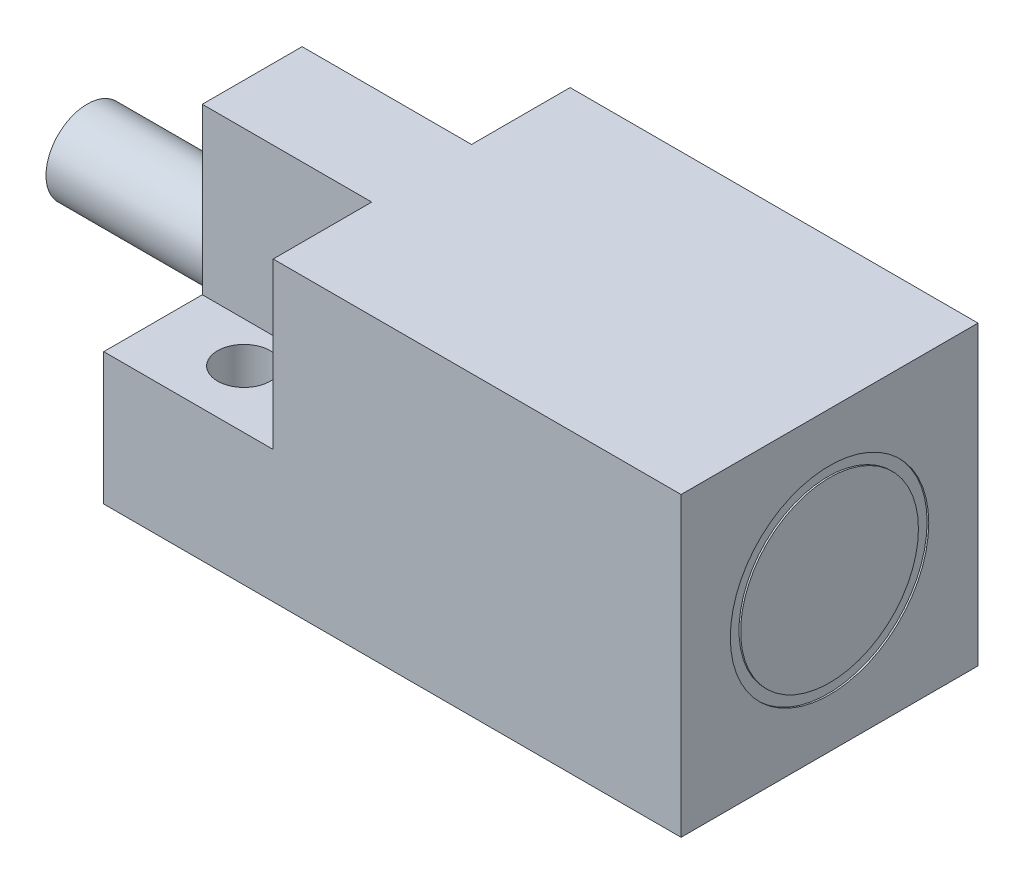
ISO-10303-21;
HEADER;
FILE_DESCRIPTION(('STEP AP214'),'2;1');
FILE_NAME('part.step','',(''),(''),'','','');
FILE_SCHEMA(('AUTOMOTIVE_DESIGN { 1 0 10303 214 1 1 1 1 }'));
ENDSEC;
DATA;
#1=APPLICATION_CONTEXT('core data for automotive mechanical design processes');
#2=APPLICATION_PROTOCOL_DEFINITION('international standard','automotive_design',2000,#1);
#3=PRODUCT_CONTEXT('',#1,'mechanical');
#4=PRODUCT('Part','Part','',(#3));
#5=PRODUCT_RELATED_PRODUCT_CATEGORY('part','',(#4));
#6=PRODUCT_DEFINITION_FORMATION('','',#4);
#7=PRODUCT_DEFINITION_CONTEXT('part definition',#1,'design');
#8=PRODUCT_DEFINITION('design','',#6,#7);
#9=PRODUCT_DEFINITION_SHAPE('','',#8);
#10=(LENGTH_UNIT() NAMED_UNIT(*) SI_UNIT(.MILLI.,.METRE.));
#11=(NAMED_UNIT(*) PLANE_ANGLE_UNIT() SI_UNIT($,.RADIAN.));
#12=(NAMED_UNIT(*) SI_UNIT($,.STERADIAN.) SOLID_ANGLE_UNIT());
#13=UNCERTAINTY_MEASURE_WITH_UNIT(LENGTH_MEASURE(1.E-05),#10,'distance_accuracy_value','');
#14=(GEOMETRIC_REPRESENTATION_CONTEXT(3) GLOBAL_UNCERTAINTY_ASSIGNED_CONTEXT((#13)) GLOBAL_UNIT_ASSIGNED_CONTEXT((#10,
#11,#12)) REPRESENTATION_CONTEXT('',''));
#15=CARTESIAN_POINT('',(0.,0.,0.));
#16=DIRECTION('',(0.,0.,1.));
#17=DIRECTION('',(1.,0.,0.));
#18=AXIS2_PLACEMENT_3D('',#15,#16,#17);
#19=CARTESIAN_POINT('',(-12.5,-9.,5.5));
#20=DIRECTION('',(0.,1.,0.));
#21=DIRECTION('',(0.,0.,1.));
#22=AXIS2_PLACEMENT_3D('',#19,#20,#21);
#23=CYLINDRICAL_SURFACE('',#22,1.6);
#24=CARTESIAN_POINT('',(-12.5,-9.,5.5));
#25=DIRECTION('',(0.,1.,0.));
#26=DIRECTION('',(0.,0.,1.));
#27=AXIS2_PLACEMENT_3D('',#24,#25,#26);
#28=CIRCLE('',#27,1.6);
#29=CARTESIAN_POINT('',(-12.5,-9.,7.1));
#30=VERTEX_POINT('',#29);
#31=EDGE_CURVE('E167',#30,#30,#28,.T.);
#32=ORIENTED_EDGE('',*,*,#31,.F.);
#33=EDGE_LOOP('',(#32));
#34=FACE_BOUND('',#33,.T.);
#35=CARTESIAN_POINT('',(-12.5,-1.,5.5));
#36=DIRECTION('',(0.,1.,0.));
#37=DIRECTION('',(0.,0.,1.));
#38=AXIS2_PLACEMENT_3D('',#35,#36,#37);
#39=CIRCLE('',#38,1.6);
#40=CARTESIAN_POINT('',(-12.5,-1.,7.1));
#41=VERTEX_POINT('',#40);
#42=EDGE_CURVE('E38',#41,#41,#39,.F.);
#43=ORIENTED_EDGE('',*,*,#42,.F.);
#44=EDGE_LOOP('',(#43));
#45=FACE_BOUND('',#44,.T.);
#46=ADVANCED_FACE('F34',(#34,#45),#23,.F.);
#47=CARTESIAN_POINT('',(-12.5,-9.,-5.5));
#48=DIRECTION('',(0.,1.,0.));
#49=DIRECTION('',(0.,0.,1.));
#50=AXIS2_PLACEMENT_3D('',#47,#48,#49);
#51=CYLINDRICAL_SURFACE('',#50,1.6);
#52=CARTESIAN_POINT('',(-12.5,-9.,-5.5));
#53=DIRECTION('',(0.,1.,0.));
#54=DIRECTION('',(0.,0.,1.));
#55=AXIS2_PLACEMENT_3D('',#52,#53,#54);
#56=CIRCLE('',#55,1.6);
#57=CARTESIAN_POINT('',(-12.5,-9.,-3.9));
#58=VERTEX_POINT('',#57);
#59=EDGE_CURVE('E170',#58,#58,#56,.T.);
#60=ORIENTED_EDGE('',*,*,#59,.F.);
#61=EDGE_LOOP('',(#60));
#62=FACE_BOUND('',#61,.T.);
#63=CARTESIAN_POINT('',(-12.5,-1.,-5.5));
#64=DIRECTION('',(0.,1.,0.));
#65=DIRECTION('',(0.,0.,1.));
#66=AXIS2_PLACEMENT_3D('',#63,#64,#65);
#67=CIRCLE('',#66,1.6);
#68=CARTESIAN_POINT('',(-12.5,-1.,-3.9));
#69=VERTEX_POINT('',#68);
#70=EDGE_CURVE('E160',#69,#69,#67,.F.);
#71=ORIENTED_EDGE('',*,*,#70,.F.);
#72=EDGE_LOOP('',(#71));
#73=FACE_BOUND('',#72,.T.);
#74=ADVANCED_FACE('F217',(#62,#73),#51,.F.);
#75=CARTESIAN_POINT('',(-17.5,9.,-9.));
#76=DIRECTION('',(1.,0.,0.));
#77=DIRECTION('',(0.,0.,-1.));
#78=AXIS2_PLACEMENT_3D('',#75,#76,#77);
#79=PLANE('',#78);
#80=DIRECTION('',(0.,0.,1.));
#81=VECTOR('',#80,1.);
#82=CARTESIAN_POINT('',(-17.5,-1.,9.));
#83=LINE('',#82,#81);
#84=CARTESIAN_POINT('',(-17.5,-1.,3.02494148541022));
#85=VERTEX_POINT('',#84);
#86=CARTESIAN_POINT('',(-17.5,-1.,9.));
#87=VERTEX_POINT('',#86);
#88=EDGE_CURVE('E127',#85,#87,#83,.T.);
#89=ORIENTED_EDGE('',*,*,#88,.F.);
#90=DIRECTION('',(0.,1.,0.));
#91=VECTOR('',#90,1.);
#92=CARTESIAN_POINT('',(-17.5,-1.,3.02494148541022));
#93=LINE('',#92,#91);
#94=CARTESIAN_POINT('',(-17.5,9.,3.02494148541022));
#95=VERTEX_POINT('',#94);
#96=EDGE_CURVE('E137',#85,#95,#93,.T.);
#97=ORIENTED_EDGE('',*,*,#96,.T.);
#98=DIRECTION('',(0.,0.,1.));
#99=VECTOR('',#98,1.);
#100=CARTESIAN_POINT('',(-17.5,9.,-9.));
#101=LINE('',#100,#99);
#102=CARTESIAN_POINT('',(-17.5,9.,-3.02494148541022));
#103=VERTEX_POINT('',#102);
#104=EDGE_CURVE('E186',#103,#95,#101,.T.);
#105=ORIENTED_EDGE('',*,*,#104,.F.);
#106=DIRECTION('',(0.,1.,0.));
#107=VECTOR('',#106,1.);
#108=CARTESIAN_POINT('',(-17.5,-1.,-3.02494148541022));
#109=LINE('',#108,#107);
#110=CARTESIAN_POINT('',(-17.5,-1.,-3.02494148541022));
#111=VERTEX_POINT('',#110);
#112=EDGE_CURVE('E59',#111,#103,#109,.T.);
#113=ORIENTED_EDGE('',*,*,#112,.F.);
#114=DIRECTION('',(0.,0.,1.));
#115=VECTOR('',#114,1.);
#116=CARTESIAN_POINT('',(-17.5,-1.,-9.));
#117=LINE('',#116,#115);
#118=CARTESIAN_POINT('',(-17.5,-1.,-9.));
#119=VERTEX_POINT('',#118);
#120=EDGE_CURVE('E142',#119,#111,#117,.T.);
#121=ORIENTED_EDGE('',*,*,#120,.F.);
#122=DIRECTION('',(0.,-1.,0.));
#123=VECTOR('',#122,1.);
#124=CARTESIAN_POINT('',(-17.5,9.,-9.));
#125=LINE('',#124,#123);
#126=CARTESIAN_POINT('',(-17.5,-9.,-9.));
#127=VERTEX_POINT('',#126);
#128=EDGE_CURVE('E196',#119,#127,#125,.T.);
#129=ORIENTED_EDGE('',*,*,#128,.T.);
#130=DIRECTION('',(0.,0.,1.));
#131=VECTOR('',#130,1.);
#132=CARTESIAN_POINT('',(-17.5,-9.,-9.));
#133=LINE('',#132,#131);
#134=CARTESIAN_POINT('',(-17.5,-9.,9.));
#135=VERTEX_POINT('',#134);
#136=EDGE_CURVE('E183',#127,#135,#133,.T.);
#137=ORIENTED_EDGE('',*,*,#136,.T.);
#138=DIRECTION('',(0.,-1.,0.));
#139=VECTOR('',#138,1.);
#140=CARTESIAN_POINT('',(-17.5,9.,9.));
#141=LINE('',#140,#139);
#142=EDGE_CURVE('E43',#87,#135,#141,.T.);
#143=ORIENTED_EDGE('',*,*,#142,.F.);
#144=EDGE_LOOP('',(#89,#97,#105,#113,#121,#129,#137,#143));
#145=FACE_BOUND('',#144,.T.);
#146=CARTESIAN_POINT('',(-17.5,0.,0.));
#147=DIRECTION('',(1.,0.,0.));
#148=DIRECTION('',(0.,0.,-1.));
#149=AXIS2_PLACEMENT_3D('',#146,#147,#148);
#150=CIRCLE('',#149,2.5);
#151=CARTESIAN_POINT('',(-17.5,0.,-2.5));
#152=VERTEX_POINT('',#151);
#153=EDGE_CURVE('E11',#152,#152,#150,.F.);
#154=ORIENTED_EDGE('',*,*,#153,.F.);
#155=EDGE_LOOP('',(#154));
#156=FACE_BOUND('',#155,.T.);
#157=ADVANCED_FACE('F36',(#145,#156),#79,.F.);
#158=CARTESIAN_POINT('',(-17.5,9.,9.));
#159=DIRECTION('',(0.,0.,-1.));
#160=DIRECTION('',(-1.,0.,0.));
#161=AXIS2_PLACEMENT_3D('',#158,#159,#160);
#162=PLANE('',#161);
#163=DIRECTION('',(1.,0.,0.));
#164=VECTOR('',#163,1.);
#165=CARTESIAN_POINT('',(-17.5,9.,9.));
#166=LINE('',#165,#164);
#167=CARTESIAN_POINT('',(-7.22890425240749,9.,9.));
#168=VERTEX_POINT('',#167);
#169=CARTESIAN_POINT('',(17.5,9.,9.));
#170=VERTEX_POINT('',#169);
#171=EDGE_CURVE('E135',#168,#170,#166,.T.);
#172=ORIENTED_EDGE('',*,*,#171,.F.);
#173=DIRECTION('',(0.,1.,0.));
#174=VECTOR('',#173,1.);
#175=CARTESIAN_POINT('',(-7.22890425240749,-1.,9.));
#176=LINE('',#175,#174);
#177=CARTESIAN_POINT('',(-7.22890425240749,-1.,9.));
#178=VERTEX_POINT('',#177);
#179=EDGE_CURVE('E51',#178,#168,#176,.T.);
#180=ORIENTED_EDGE('',*,*,#179,.F.);
#181=DIRECTION('',(1.,0.,0.));
#182=VECTOR('',#181,1.);
#183=CARTESIAN_POINT('',(-17.5,-1.,9.));
#184=LINE('',#183,#182);
#185=EDGE_CURVE('E121',#87,#178,#184,.T.);
#186=ORIENTED_EDGE('',*,*,#185,.F.);
#187=ORIENTED_EDGE('',*,*,#142,.T.);
#188=DIRECTION('',(1.,0.,0.));
#189=VECTOR('',#188,1.);
#190=CARTESIAN_POINT('',(-17.5,-9.,9.));
#191=LINE('',#190,#189);
#192=CARTESIAN_POINT('',(17.5,-9.,9.));
#193=VERTEX_POINT('',#192);
#194=EDGE_CURVE('E199',#135,#193,#191,.T.);
#195=ORIENTED_EDGE('',*,*,#194,.T.);
#196=DIRECTION('',(0.,-1.,0.));
#197=VECTOR('',#196,1.);
#198=CARTESIAN_POINT('',(17.5,9.,9.));
#199=LINE('',#198,#197);
#200=EDGE_CURVE('E209',#170,#193,#199,.T.);
#201=ORIENTED_EDGE('',*,*,#200,.F.);
#202=EDGE_LOOP('',(#172,#180,#186,#187,#195,#201));
#203=FACE_BOUND('',#202,.T.);
#204=ADVANCED_FACE('F133',(#203),#162,.F.);
#205=CARTESIAN_POINT('',(17.5,9.,-9.));
#206=DIRECTION('',(-1.,0.,0.));
#207=DIRECTION('',(0.,0.,1.));
#208=AXIS2_PLACEMENT_3D('',#205,#206,#207);
#209=PLANE('',#208);
#210=CARTESIAN_POINT('',(17.5,0.,0.));
#211=DIRECTION('',(1.,0.,0.));
#212=DIRECTION('',(0.,0.,-1.));
#213=AXIS2_PLACEMENT_3D('',#210,#211,#212);
#214=CIRCLE('',#213,6.0156909208461);
#215=CARTESIAN_POINT('',(17.5,0.,-6.0156909208461));
#216=VERTEX_POINT('',#215);
#217=EDGE_CURVE('E177',#216,#216,#214,.T.);
#218=ORIENTED_EDGE('',*,*,#217,.F.);
#219=EDGE_LOOP('',(#218));
#220=FACE_BOUND('',#219,.T.);
#221=DIRECTION('',(0.,0.,-1.));
#222=VECTOR('',#221,1.);
#223=CARTESIAN_POINT('',(17.5,-9.,-9.));
#224=LINE('',#223,#222);
#225=CARTESIAN_POINT('',(17.5,-9.,-9.));
#226=VERTEX_POINT('',#225);
#227=EDGE_CURVE('E201',#193,#226,#224,.T.);
#228=ORIENTED_EDGE('',*,*,#227,.T.);
#229=DIRECTION('',(0.,-1.,0.));
#230=VECTOR('',#229,1.);
#231=CARTESIAN_POINT('',(17.5,9.,-9.));
#232=LINE('',#231,#230);
#233=CARTESIAN_POINT('',(17.5,9.,-9.));
#234=VERTEX_POINT('',#233);
#235=EDGE_CURVE('E206',#234,#226,#232,.T.);
#236=ORIENTED_EDGE('',*,*,#235,.F.);
#237=DIRECTION('',(0.,0.,-1.));
#238=VECTOR('',#237,1.);
#239=CARTESIAN_POINT('',(17.5,9.,-9.));
#240=LINE('',#239,#238);
#241=EDGE_CURVE('E191',#170,#234,#240,.T.);
#242=ORIENTED_EDGE('',*,*,#241,.F.);
#243=ORIENTED_EDGE('',*,*,#200,.T.);
#244=EDGE_LOOP('',(#228,#236,#242,#243));
#245=FACE_BOUND('',#244,.T.);
#246=ADVANCED_FACE('F255',(#220,#245),#209,.F.);
#247=CARTESIAN_POINT('',(-17.5,9.,-9.));
#248=DIRECTION('',(0.,0.,1.));
#249=DIRECTION('',(1.,0.,0.));
#250=AXIS2_PLACEMENT_3D('',#247,#248,#249);
#251=PLANE('',#250);
#252=DIRECTION('',(-1.,0.,0.));
#253=VECTOR('',#252,1.);
#254=CARTESIAN_POINT('',(-17.5,-1.,-9.));
#255=LINE('',#254,#253);
#256=CARTESIAN_POINT('',(-7.22890425240749,-1.,-9.));
#257=VERTEX_POINT('',#256);
#258=EDGE_CURVE('E152',#257,#119,#255,.T.);
#259=ORIENTED_EDGE('',*,*,#258,.F.);
#260=DIRECTION('',(0.,1.,0.));
#261=VECTOR('',#260,1.);
#262=CARTESIAN_POINT('',(-7.22890425240749,-1.,-9.));
#263=LINE('',#262,#261);
#264=CARTESIAN_POINT('',(-7.22890425240749,9.,-9.));
#265=VERTEX_POINT('',#264);
#266=EDGE_CURVE('E157',#257,#265,#263,.T.);
#267=ORIENTED_EDGE('',*,*,#266,.T.);
#268=DIRECTION('',(-1.,0.,0.));
#269=VECTOR('',#268,1.);
#270=CARTESIAN_POINT('',(-17.5,9.,-9.));
#271=LINE('',#270,#269);
#272=EDGE_CURVE('E193',#234,#265,#271,.T.);
#273=ORIENTED_EDGE('',*,*,#272,.F.);
#274=ORIENTED_EDGE('',*,*,#235,.T.);
#275=DIRECTION('',(-1.,0.,0.));
#276=VECTOR('',#275,1.);
#277=CARTESIAN_POINT('',(-17.5,-9.,-9.));
#278=LINE('',#277,#276);
#279=EDGE_CURVE('E189',#226,#127,#278,.T.);
#280=ORIENTED_EDGE('',*,*,#279,.T.);
#281=ORIENTED_EDGE('',*,*,#128,.F.);
#282=EDGE_LOOP('',(#259,#267,#273,#274,#280,#281));
#283=FACE_BOUND('',#282,.T.);
#284=ADVANCED_FACE('F248',(#283),#251,.F.);
#285=CARTESIAN_POINT('',(-17.5,9.,9.));
#286=DIRECTION('',(0.,1.,0.));
#287=DIRECTION('',(0.,0.,1.));
#288=AXIS2_PLACEMENT_3D('',#285,#286,#287);
#289=PLANE('',#288);
#290=DIRECTION('',(-1.,0.,0.));
#291=VECTOR('',#290,1.);
#292=CARTESIAN_POINT('',(-17.5,9.,3.02494148541022));
#293=LINE('',#292,#291);
#294=CARTESIAN_POINT('',(-7.22890425240749,9.,3.02494148541022));
#295=VERTEX_POINT('',#294);
#296=EDGE_CURVE('E130',#295,#95,#293,.T.);
#297=ORIENTED_EDGE('',*,*,#296,.F.);
#298=DIRECTION('',(0.,0.,-1.));
#299=VECTOR('',#298,1.);
#300=CARTESIAN_POINT('',(-7.22890425240749,9.,9.));
#301=LINE('',#300,#299);
#302=EDGE_CURVE('E409',#168,#295,#301,.T.);
#303=ORIENTED_EDGE('',*,*,#302,.F.);
#304=ORIENTED_EDGE('',*,*,#171,.T.);
#305=ORIENTED_EDGE('',*,*,#241,.T.);
#306=ORIENTED_EDGE('',*,*,#272,.T.);
#307=DIRECTION('',(0.,0.,-1.));
#308=VECTOR('',#307,1.);
#309=CARTESIAN_POINT('',(-7.22890425240749,9.,-9.));
#310=LINE('',#309,#308);
#311=CARTESIAN_POINT('',(-7.22890425240749,9.,-3.02494148541022));
#312=VERTEX_POINT('',#311);
#313=EDGE_CURVE('E146',#312,#265,#310,.T.);
#314=ORIENTED_EDGE('',*,*,#313,.F.);
#315=DIRECTION('',(1.,0.,0.));
#316=VECTOR('',#315,1.);
#317=CARTESIAN_POINT('',(-17.5,9.,-3.02494148541022));
#318=LINE('',#317,#316);
#319=EDGE_CURVE('E154',#103,#312,#318,.T.);
#320=ORIENTED_EDGE('',*,*,#319,.F.);
#321=ORIENTED_EDGE('',*,*,#104,.T.);
#322=EDGE_LOOP('',(#297,#303,#304,#305,#306,#314,#320,#321));
#323=FACE_BOUND('',#322,.T.);
#324=ADVANCED_FACE('F245',(#323),#289,.T.);
#325=CARTESIAN_POINT('',(-17.5,-9.,9.));
#326=DIRECTION('',(0.,1.,0.));
#327=DIRECTION('',(0.,0.,1.));
#328=AXIS2_PLACEMENT_3D('',#325,#326,#327);
#329=PLANE('',#328);
#330=ORIENTED_EDGE('',*,*,#31,.T.);
#331=EDGE_LOOP('',(#330));
#332=FACE_BOUND('',#331,.T.);
#333=ORIENTED_EDGE('',*,*,#59,.T.);
#334=EDGE_LOOP('',(#333));
#335=FACE_BOUND('',#334,.T.);
#336=ORIENTED_EDGE('',*,*,#136,.F.);
#337=ORIENTED_EDGE('',*,*,#279,.F.);
#338=ORIENTED_EDGE('',*,*,#227,.F.);
#339=ORIENTED_EDGE('',*,*,#194,.F.);
#340=EDGE_LOOP('',(#336,#337,#338,#339));
#341=FACE_BOUND('',#340,.T.);
#342=ADVANCED_FACE('F243',(#332,#335,#341),#329,.F.);
#343=CARTESIAN_POINT('',(17.4,0.,0.));
#344=DIRECTION('',(1.,0.,0.));
#345=DIRECTION('',(0.,0.,-1.));
#346=AXIS2_PLACEMENT_3D('',#343,#344,#345);
#347=CYLINDRICAL_SURFACE('',#346,6.0156909208461);
#348=CARTESIAN_POINT('',(17.4,0.,0.));
#349=DIRECTION('',(1.,0.,0.));
#350=DIRECTION('',(0.,0.,-1.));
#351=AXIS2_PLACEMENT_3D('',#348,#349,#350);
#352=CIRCLE('',#351,6.0156909208461);
#353=CARTESIAN_POINT('',(17.4,0.,-6.0156909208461));
#354=VERTEX_POINT('',#353);
#355=EDGE_CURVE('E180',#354,#354,#352,.T.);
#356=ORIENTED_EDGE('',*,*,#355,.F.);
#357=EDGE_LOOP('',(#356));
#358=FACE_BOUND('',#357,.T.);
#359=ORIENTED_EDGE('',*,*,#217,.T.);
#360=EDGE_LOOP('',(#359));
#361=FACE_BOUND('',#360,.T.);
#362=ADVANCED_FACE('F239',(#358,#361),#347,.F.);
#363=CARTESIAN_POINT('',(17.4,0.,0.));
#364=DIRECTION('',(1.,0.,0.));
#365=DIRECTION('',(0.,0.,-1.));
#366=AXIS2_PLACEMENT_3D('',#363,#364,#365);
#367=PLANE('',#366);
#368=CARTESIAN_POINT('',(17.4,0.,0.));
#369=DIRECTION('',(1.,0.,0.));
#370=DIRECTION('',(0.,0.,-1.));
#371=AXIS2_PLACEMENT_3D('',#368,#369,#370);
#372=CIRCLE('',#371,5.38989032325786);
#373=CARTESIAN_POINT('',(17.4,0.,-5.38989032325786));
#374=VERTEX_POINT('',#373);
#375=EDGE_CURVE('E174',#374,#374,#372,.T.);
#376=ORIENTED_EDGE('',*,*,#375,.F.);
#377=EDGE_LOOP('',(#376));
#378=FACE_BOUND('',#377,.T.);
#379=ORIENTED_EDGE('',*,*,#355,.T.);
#380=EDGE_LOOP('',(#379));
#381=FACE_BOUND('',#380,.T.);
#382=ADVANCED_FACE('F235',(#378,#381),#367,.T.);
#383=CARTESIAN_POINT('',(17.4,0.,0.));
#384=DIRECTION('',(1.,0.,0.));
#385=DIRECTION('',(0.,0.,-1.));
#386=AXIS2_PLACEMENT_3D('',#383,#384,#385);
#387=CYLINDRICAL_SURFACE('',#386,5.38989032325786);
#388=ORIENTED_EDGE('',*,*,#375,.T.);
#389=EDGE_LOOP('',(#388));
#390=FACE_BOUND('',#389,.T.);
#391=CARTESIAN_POINT('',(17.5,0.,0.));
#392=DIRECTION('',(1.,0.,0.));
#393=DIRECTION('',(0.,0.,-1.));
#394=AXIS2_PLACEMENT_3D('',#391,#392,#393);
#395=CIRCLE('',#394,5.38989032325786);
#396=CARTESIAN_POINT('',(17.5,0.,-5.38989032325786));
#397=VERTEX_POINT('',#396);
#398=EDGE_CURVE('E173',#397,#397,#395,.T.);
#399=ORIENTED_EDGE('',*,*,#398,.F.);
#400=EDGE_LOOP('',(#399));
#401=FACE_BOUND('',#400,.T.);
#402=ADVANCED_FACE('F231',(#390,#401),#387,.T.);
#403=ORIENTED_EDGE('',*,*,#398,.T.);
#404=EDGE_LOOP('',(#403));
#405=FACE_BOUND('',#404,.T.);
#406=ADVANCED_FACE('F234',(#405),#209,.F.);
#407=CARTESIAN_POINT('',(-27.5,0.,0.));
#408=DIRECTION('',(1.,0.,0.));
#409=DIRECTION('',(0.,0.,-1.));
#410=AXIS2_PLACEMENT_3D('',#407,#408,#409);
#411=CYLINDRICAL_SURFACE('',#410,2.5);
#412=CARTESIAN_POINT('',(-27.5,0.,0.));
#413=DIRECTION('',(-1.,0.,0.));
#414=DIRECTION('',(0.,0.,1.));
#415=AXIS2_PLACEMENT_3D('',#412,#413,#414);
#416=CIRCLE('',#415,2.5);
#417=CARTESIAN_POINT('',(-27.5,0.,2.5));
#418=VERTEX_POINT('',#417);
#419=EDGE_CURVE('E164',#418,#418,#416,.T.);
#420=ORIENTED_EDGE('',*,*,#419,.F.);
#421=EDGE_LOOP('',(#420));
#422=FACE_BOUND('',#421,.T.);
#423=ORIENTED_EDGE('',*,*,#153,.T.);
#424=EDGE_LOOP('',(#423));
#425=FACE_BOUND('',#424,.T.);
#426=ADVANCED_FACE('F300',(#422,#425),#411,.T.);
#427=CARTESIAN_POINT('',(-27.5,0.,0.));
#428=DIRECTION('',(-1.,0.,0.));
#429=DIRECTION('',(0.,0.,1.));
#430=AXIS2_PLACEMENT_3D('',#427,#428,#429);
#431=PLANE('',#430);
#432=ORIENTED_EDGE('',*,*,#419,.T.);
#433=EDGE_LOOP('',(#432));
#434=FACE_BOUND('',#433,.T.);
#435=ADVANCED_FACE('F306',(#434),#431,.T.);
#436=CARTESIAN_POINT('',(-17.5,-1.,-3.02494148541022));
#437=DIRECTION('',(0.,1.,0.));
#438=DIRECTION('',(0.,0.,1.));
#439=AXIS2_PLACEMENT_3D('',#436,#437,#438);
#440=PLANE('',#439);
#441=ORIENTED_EDGE('',*,*,#120,.T.);
#442=DIRECTION('',(1.,0.,0.));
#443=VECTOR('',#442,1.);
#444=CARTESIAN_POINT('',(-17.5,-1.,-3.02494148541022));
#445=LINE('',#444,#443);
#446=CARTESIAN_POINT('',(-7.22890425240749,-1.,-3.02494148541022));
#447=VERTEX_POINT('',#446);
#448=EDGE_CURVE('E145',#111,#447,#445,.T.);
#449=ORIENTED_EDGE('',*,*,#448,.T.);
#450=DIRECTION('',(0.,0.,-1.));
#451=VECTOR('',#450,1.);
#452=CARTESIAN_POINT('',(-7.22890425240749,-1.,-9.));
#453=LINE('',#452,#451);
#454=EDGE_CURVE('E149',#447,#257,#453,.T.);
#455=ORIENTED_EDGE('',*,*,#454,.T.);
#456=ORIENTED_EDGE('',*,*,#258,.T.);
#457=EDGE_LOOP('',(#441,#449,#455,#456));
#458=FACE_BOUND('',#457,.T.);
#459=ORIENTED_EDGE('',*,*,#70,.T.);
#460=EDGE_LOOP('',(#459));
#461=FACE_BOUND('',#460,.T.);
#462=ADVANCED_FACE('F215',(#458,#461),#440,.T.);
#463=CARTESIAN_POINT('',(-7.22890425240749,-1.,-9.));
#464=DIRECTION('',(1.,0.,0.));
#465=DIRECTION('',(0.,0.,-1.));
#466=AXIS2_PLACEMENT_3D('',#463,#464,#465);
#467=PLANE('',#466);
#468=ORIENTED_EDGE('',*,*,#313,.T.);
#469=ORIENTED_EDGE('',*,*,#266,.F.);
#470=ORIENTED_EDGE('',*,*,#454,.F.);
#471=DIRECTION('',(0.,1.,0.));
#472=VECTOR('',#471,1.);
#473=CARTESIAN_POINT('',(-7.22890425240749,-1.,-3.02494148541022));
#474=LINE('',#473,#472);
#475=EDGE_CURVE('E161',#447,#312,#474,.T.);
#476=ORIENTED_EDGE('',*,*,#475,.T.);
#477=EDGE_LOOP('',(#468,#469,#470,#476));
#478=FACE_BOUND('',#477,.T.);
#479=ADVANCED_FACE('F320',(#478),#467,.F.);
#480=CARTESIAN_POINT('',(-17.5,-1.,-3.02494148541022));
#481=DIRECTION('',(0.,0.,1.));
#482=DIRECTION('',(1.,0.,0.));
#483=AXIS2_PLACEMENT_3D('',#480,#481,#482);
#484=PLANE('',#483);
#485=ORIENTED_EDGE('',*,*,#319,.T.);
#486=ORIENTED_EDGE('',*,*,#475,.F.);
#487=ORIENTED_EDGE('',*,*,#448,.F.);
#488=ORIENTED_EDGE('',*,*,#112,.T.);
#489=EDGE_LOOP('',(#485,#486,#487,#488));
#490=FACE_BOUND('',#489,.T.);
#491=ADVANCED_FACE('F328',(#490),#484,.F.);
#492=CARTESIAN_POINT('',(-7.22890425240749,-1.,9.));
#493=DIRECTION('',(0.,1.,0.));
#494=DIRECTION('',(0.,0.,1.));
#495=AXIS2_PLACEMENT_3D('',#492,#493,#494);
#496=PLANE('',#495);
#497=ORIENTED_EDGE('',*,*,#185,.T.);
#498=DIRECTION('',(0.,0.,-1.));
#499=VECTOR('',#498,1.);
#500=CARTESIAN_POINT('',(-7.22890425240749,-1.,9.));
#501=LINE('',#500,#499);
#502=CARTESIAN_POINT('',(-7.22890425240749,-1.,3.02494148541022));
#503=VERTEX_POINT('',#502);
#504=EDGE_CURVE('E113',#178,#503,#501,.T.);
#505=ORIENTED_EDGE('',*,*,#504,.T.);
#506=DIRECTION('',(-1.,0.,0.));
#507=VECTOR('',#506,1.);
#508=CARTESIAN_POINT('',(-17.5,-1.,3.02494148541022));
#509=LINE('',#508,#507);
#510=EDGE_CURVE('E120',#503,#85,#509,.T.);
#511=ORIENTED_EDGE('',*,*,#510,.T.);
#512=ORIENTED_EDGE('',*,*,#88,.T.);
#513=EDGE_LOOP('',(#497,#505,#511,#512));
#514=FACE_BOUND('',#513,.T.);
#515=ORIENTED_EDGE('',*,*,#42,.T.);
#516=EDGE_LOOP('',(#515));
#517=FACE_BOUND('',#516,.T.);
#518=ADVANCED_FACE('F124',(#514,#517),#496,.T.);
#519=CARTESIAN_POINT('',(-17.5,-1.,3.02494148541022));
#520=DIRECTION('',(0.,0.,-1.));
#521=DIRECTION('',(-1.,0.,0.));
#522=AXIS2_PLACEMENT_3D('',#519,#520,#521);
#523=PLANE('',#522);
#524=ORIENTED_EDGE('',*,*,#296,.T.);
#525=ORIENTED_EDGE('',*,*,#96,.F.);
#526=ORIENTED_EDGE('',*,*,#510,.F.);
#527=DIRECTION('',(0.,1.,0.));
#528=VECTOR('',#527,1.);
#529=CARTESIAN_POINT('',(-7.22890425240749,-1.,3.02494148541022));
#530=LINE('',#529,#528);
#531=EDGE_CURVE('E116',#503,#295,#530,.T.);
#532=ORIENTED_EDGE('',*,*,#531,.T.);
#533=EDGE_LOOP('',(#524,#525,#526,#532));
#534=FACE_BOUND('',#533,.T.);
#535=ADVANCED_FACE('F342',(#534),#523,.F.);
#536=CARTESIAN_POINT('',(-7.22890425240749,-1.,9.));
#537=DIRECTION('',(1.,0.,0.));
#538=DIRECTION('',(0.,0.,-1.));
#539=AXIS2_PLACEMENT_3D('',#536,#537,#538);
#540=PLANE('',#539);
#541=ORIENTED_EDGE('',*,*,#302,.T.);
#542=ORIENTED_EDGE('',*,*,#531,.F.);
#543=ORIENTED_EDGE('',*,*,#504,.F.);
#544=ORIENTED_EDGE('',*,*,#179,.T.);
#545=EDGE_LOOP('',(#541,#542,#543,#544));
#546=FACE_BOUND('',#545,.T.);
#547=ADVANCED_FACE('F115',(#546),#540,.F.);
#548=CLOSED_SHELL('',(#46,#74,#157,#204,#246,#284,#324,#342,#362,#382,#402,#406,#426,#435,#462,
#479,#491,#518,#535,#547));
#549=MANIFOLD_SOLID_BREP('B2',#548);
#550=ADVANCED_BREP_SHAPE_REPRESENTATION('',(#18,#549),#14);
#551=SHAPE_DEFINITION_REPRESENTATION(#9,#550);
ENDSEC;
END-ISO-10303-21;
